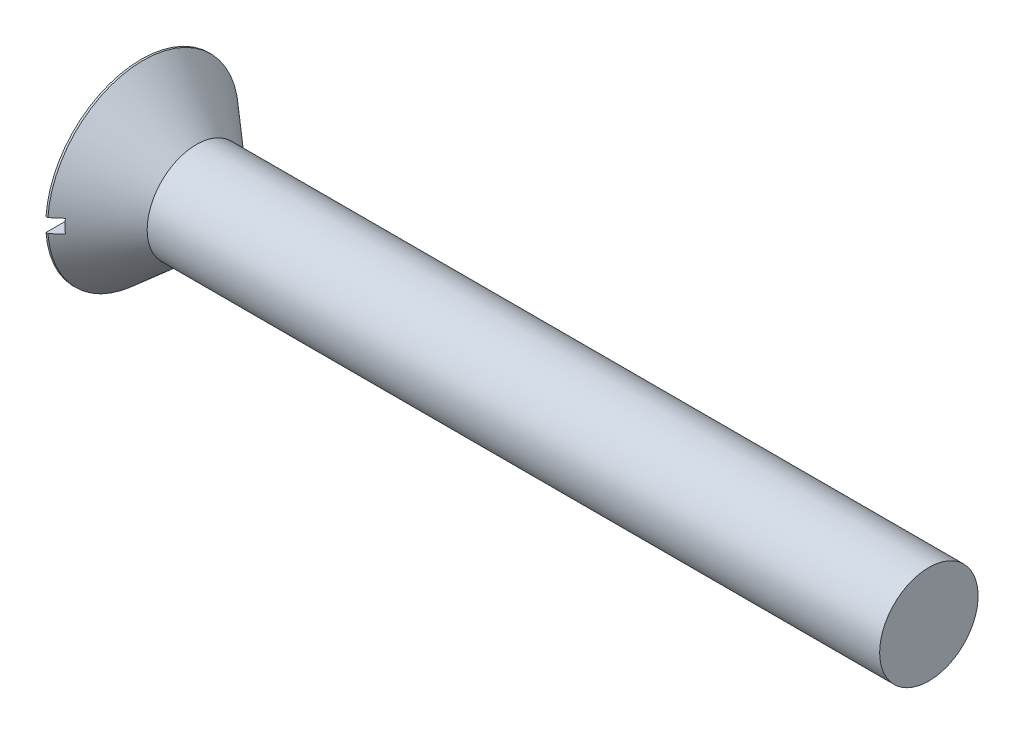
ISO-10303-21;
HEADER;
FILE_DESCRIPTION(('STEP AP214'),'2;1');
FILE_NAME('part.step','',(''),(''),'','','');
FILE_SCHEMA(('AUTOMOTIVE_DESIGN { 1 0 10303 214 1 1 1 1 }'));
ENDSEC;
DATA;
#1=APPLICATION_CONTEXT('core data for automotive mechanical design processes');
#2=APPLICATION_PROTOCOL_DEFINITION('international standard','automotive_design',2000,#1);
#3=PRODUCT_CONTEXT('',#1,'mechanical');
#4=PRODUCT('Part','Part','',(#3));
#5=PRODUCT_RELATED_PRODUCT_CATEGORY('part','',(#4));
#6=PRODUCT_DEFINITION_FORMATION('','',#4);
#7=PRODUCT_DEFINITION_CONTEXT('part definition',#1,'design');
#8=PRODUCT_DEFINITION('design','',#6,#7);
#9=PRODUCT_DEFINITION_SHAPE('','',#8);
#10=(LENGTH_UNIT() NAMED_UNIT(*) SI_UNIT(.MILLI.,.METRE.));
#11=(NAMED_UNIT(*) PLANE_ANGLE_UNIT() SI_UNIT($,.RADIAN.));
#12=(NAMED_UNIT(*) SI_UNIT($,.STERADIAN.) SOLID_ANGLE_UNIT());
#13=UNCERTAINTY_MEASURE_WITH_UNIT(LENGTH_MEASURE(1.E-05),#10,'distance_accuracy_value','');
#14=(GEOMETRIC_REPRESENTATION_CONTEXT(3) GLOBAL_UNCERTAINTY_ASSIGNED_CONTEXT((#13)) GLOBAL_UNIT_ASSIGNED_CONTEXT((#10,
#11,#12)) REPRESENTATION_CONTEXT('',''));
#15=CARTESIAN_POINT('',(0.,0.,0.));
#16=DIRECTION('',(0.,0.,1.));
#17=DIRECTION('',(1.,0.,0.));
#18=AXIS2_PLACEMENT_3D('',#15,#16,#17);
#19=CARTESIAN_POINT('',(0.,0.,0.));
#20=DIRECTION('',(-1.,0.,0.));
#21=DIRECTION('',(0.,0.,1.));
#22=AXIS2_PLACEMENT_3D('',#19,#20,#21);
#23=PLANE('',#22);
#24=DIRECTION('',(0.,0.,-1.));
#25=VECTOR('',#24,1.);
#26=CARTESIAN_POINT('',(0.,0.889000000000002,12.319));
#27=LINE('',#26,#25);
#28=CARTESIAN_POINT('',(0.,0.889000000000001,12.286880808407));
#29=VERTEX_POINT('',#28);
#30=CARTESIAN_POINT('',(0.,0.888999999999998,-12.286880808407));
#31=VERTEX_POINT('',#30);
#32=EDGE_CURVE('E167',#29,#31,#27,.T.);
#33=ORIENTED_EDGE('',*,*,#32,.F.);
#34=CARTESIAN_POINT('',(0.,0.,0.));
#35=DIRECTION('',(-1.,0.,0.));
#36=DIRECTION('',(0.,0.,1.));
#37=AXIS2_PLACEMENT_3D('',#34,#35,#36);
#38=CIRCLE('',#37,12.319);
#39=EDGE_CURVE('E110',#29,#31,#38,.T.);
#40=ORIENTED_EDGE('',*,*,#39,.T.);
#41=EDGE_LOOP('',(#33,#40));
#42=FACE_BOUND('',#41,.T.);
#43=ADVANCED_FACE('F41',(#42),#23,.T.);
#44=CARTESIAN_POINT('',(-6.34999999999999,0.,0.));
#45=DIRECTION('',(-1.,0.,0.));
#46=DIRECTION('',(0.,0.,1.));
#47=AXIS2_PLACEMENT_3D('',#44,#45,#46);
#48=CYLINDRICAL_SURFACE('',#47,12.319);
#49=DIRECTION('',(-1.,0.,0.));
#50=VECTOR('',#49,1.);
#51=CARTESIAN_POINT('',(-6.34999999999999,0.888999999999999,-12.286880808407));
#52=LINE('',#51,#50);
#53=CARTESIAN_POINT('',(0.245450977297823,0.888999999999999,-12.286880808407));
#54=VERTEX_POINT('',#53);
#55=EDGE_CURVE('E71',#31,#54,#52,.F.);
#56=ORIENTED_EDGE('',*,*,#55,.F.);
#57=ORIENTED_EDGE('',*,*,#39,.F.);
#58=DIRECTION('',(-1.,0.,0.));
#59=VECTOR('',#58,1.);
#60=CARTESIAN_POINT('',(-6.34999999999999,0.889000000000002,12.286880808407));
#61=LINE('',#60,#59);
#62=CARTESIAN_POINT('',(0.245450977297822,0.889000000000002,12.286880808407));
#63=VERTEX_POINT('',#62);
#64=EDGE_CURVE('E170',#63,#29,#61,.T.);
#65=ORIENTED_EDGE('',*,*,#64,.F.);
#66=CARTESIAN_POINT('',(0.245450977297823,0.,0.));
#67=DIRECTION('',(-1.,0.,0.));
#68=DIRECTION('',(0.,0.,1.));
#69=AXIS2_PLACEMENT_3D('',#66,#67,#68);
#70=CIRCLE('',#69,12.319);
#71=EDGE_CURVE('E122',#63,#54,#70,.T.);
#72=ORIENTED_EDGE('',*,*,#71,.T.);
#73=EDGE_LOOP('',(#56,#57,#65,#72));
#74=FACE_BOUND('',#73,.T.);
#75=ADVANCED_FACE('F169',(#74),#48,.T.);
#76=DIRECTION('',(0.,0.,1.));
#77=VECTOR('',#76,1.);
#78=CARTESIAN_POINT('',(0.,-0.889000000000001,-12.319));
#79=LINE('',#78,#77);
#80=CARTESIAN_POINT('',(0.,-0.889000000000001,-12.286880808407));
#81=VERTEX_POINT('',#80);
#82=CARTESIAN_POINT('',(0.,-0.889000000000001,12.286880808407));
#83=VERTEX_POINT('',#82);
#84=EDGE_CURVE('E116',#81,#83,#79,.T.);
#85=ORIENTED_EDGE('',*,*,#84,.F.);
#86=EDGE_CURVE('E146',#81,#83,#38,.T.);
#87=ORIENTED_EDGE('',*,*,#86,.T.);
#88=EDGE_LOOP('',(#85,#87));
#89=FACE_BOUND('',#88,.T.);
#90=ADVANCED_FACE('F43',(#89),#23,.T.);
#91=DIRECTION('',(-1.,0.,0.));
#92=VECTOR('',#91,1.);
#93=CARTESIAN_POINT('',(-6.34999999999999,-0.889000000000001,12.286880808407));
#94=LINE('',#93,#92);
#95=CARTESIAN_POINT('',(0.245450977297823,-0.889000000000001,12.286880808407));
#96=VERTEX_POINT('',#95);
#97=EDGE_CURVE('E148',#83,#96,#94,.F.);
#98=ORIENTED_EDGE('',*,*,#97,.F.);
#99=ORIENTED_EDGE('',*,*,#86,.F.);
#100=DIRECTION('',(-1.,0.,0.));
#101=VECTOR('',#100,1.);
#102=CARTESIAN_POINT('',(-6.34999999999999,-0.889000000000001,-12.286880808407));
#103=LINE('',#102,#101);
#104=CARTESIAN_POINT('',(0.245450977297823,-0.889000000000001,-12.286880808407));
#105=VERTEX_POINT('',#104);
#106=EDGE_CURVE('E136',#105,#81,#103,.T.);
#107=ORIENTED_EDGE('',*,*,#106,.F.);
#108=EDGE_CURVE('E144',#105,#96,#70,.T.);
#109=ORIENTED_EDGE('',*,*,#108,.T.);
#110=EDGE_LOOP('',(#98,#99,#107,#109));
#111=FACE_BOUND('',#110,.T.);
#112=ADVANCED_FACE('F143',(#111),#48,.T.);
#113=CARTESIAN_POINT('',(0.245450977297823,0.,0.));
#114=DIRECTION('',(-1.,0.,0.));
#115=DIRECTION('',(0.,0.,1.));
#116=AXIS2_PLACEMENT_3D('',#113,#114,#115);
#117=CONICAL_SURFACE('',#116,12.319,0.715584993317677);
#118=CARTESIAN_POINT('',(-14.5551411587931,0.888999999999997,-25.169263227534));
#119=CARTESIAN_POINT('',(-13.6116315748377,0.888999999999997,-24.3485679447048));
#120=CARTESIAN_POINT('',(-12.6681435319224,0.888999999999997,-23.5278478918582));
#121=CARTESIAN_POINT('',(-10.7812351121085,0.888999999999997,-21.8863288242787));
#122=CARTESIAN_POINT('',(-9.83781473525217,0.888999999999997,-21.0655298094972));
#123=CARTESIAN_POINT('',(-7.95103007076821,0.888999999999998,-19.4237919313902));
#124=CARTESIAN_POINT('',(-7.00766578683745,0.888999999999998,-18.6028530638159));
#125=CARTESIAN_POINT('',(-5.12107540454132,0.888999999999998,-16.9608176849098));
#126=CARTESIAN_POINT('',(-4.17784930609396,0.888999999999998,-16.1397211736721));
#127=CARTESIAN_POINT('',(-2.26628909618739,0.888999999999998,-14.4752311823123));
#128=CARTESIAN_POINT('',(-1.29796083579062,0.888999999999998,-13.6318309826034));
#129=CARTESIAN_POINT('',(0.638319260654705,0.888999999999999,-11.9445949963252));
#130=CARTESIAN_POINT('',(1.60627109603541,0.888999999999999,-11.1007592089892));
#131=CARTESIAN_POINT('',(3.05762484421906,0.888999999999999,-9.83437996543735));
#132=CARTESIAN_POINT('',(3.54130575594833,0.888999999999999,-9.41215628639985));
#133=CARTESIAN_POINT('',(4.50838694687554,0.888999999999999,-8.56738769648048));
#134=CARTESIAN_POINT('',(4.9917872261095,0.888999999999999,-8.14484278563986));
#135=CARTESIAN_POINT('',(5.95814599419228,0.888999999999999,-7.29925088262449));
#136=CARTESIAN_POINT('',(6.44110448432653,0.888999999999999,-6.87620389191886));
#137=CARTESIAN_POINT('',(7.4062875505902,0.888999999999999,-6.02927377170035));
#138=CARTESIAN_POINT('',(7.88851212763372,0.888999999999999,-5.6053906432304));
#139=CARTESIAN_POINT('',(8.6195277039508,0.888999999999999,-4.96063042196199));
#140=CARTESIAN_POINT('',(8.86884178125162,0.888999999999999,-4.74034671780844));
#141=CARTESIAN_POINT('',(9.36689414916273,0.888999999999999,-4.29910334302774));
#142=CARTESIAN_POINT('',(9.61563240947002,0.889,-4.07814363818477));
#143=CARTESIAN_POINT('',(10.1107929185816,0.889,-3.63643149913079));
#144=CARTESIAN_POINT('',(10.3572203299295,0.888999999999999,-3.41568486558542));
#145=CARTESIAN_POINT('',(10.7256374787167,0.889,-3.08324196593378));
#146=CARTESIAN_POINT('',(10.8482306903894,0.889,-2.97221496629208));
#147=CARTESIAN_POINT('',(11.0928524713659,0.889,-2.74954082117221));
#148=CARTESIAN_POINT('',(11.2148810421947,0.889,-2.63789367737072));
#149=CARTESIAN_POINT('',(11.4577513940792,0.889,-2.41407707228762));
#150=CARTESIAN_POINT('',(11.5785957009388,0.889,-2.30191035898632));
#151=CARTESIAN_POINT('',(11.8191202959369,0.889,-2.07624210041266));
#152=CARTESIAN_POINT('',(11.9388001166896,0.889,-1.96274005653881));
#153=CARTESIAN_POINT('',(12.1775970240016,0.889,-1.732420959755));
#154=CARTESIAN_POINT('',(12.2966921052508,0.889,-1.61558085840986));
#155=CARTESIAN_POINT('',(12.4725944631053,0.889,-1.43771774183129));
#156=CARTESIAN_POINT('',(12.530744355155,0.889,-1.37802576488454));
#157=CARTESIAN_POINT('',(12.6457640471361,0.889,-1.2574213794329));
#158=CARTESIAN_POINT('',(12.7026339361501,0.889,-1.19650905641988));
#159=CARTESIAN_POINT('',(12.8154060379138,0.889,-1.07197692667333));
#160=CARTESIAN_POINT('',(12.8712775685345,0.889,-1.00832922348416));
#161=CARTESIAN_POINT('',(12.9799876814358,0.889,-0.878506288214569));
#162=CARTESIAN_POINT('',(13.032828179744,0.889,-0.812332697907101));
#163=CARTESIAN_POINT('',(13.1078788460938,0.889,-0.710676010668516));
#164=CARTESIAN_POINT('',(13.13203848091,0.889,-0.676638743704657));
#165=CARTESIAN_POINT('',(13.1786577281485,0.889,-0.607425717644619));
#166=CARTESIAN_POINT('',(13.2011179695318,0.889,-0.572250386705729));
#167=CARTESIAN_POINT('',(13.2436554341221,0.889,-0.500673329171807));
#168=CARTESIAN_POINT('',(13.2637423021657,0.889,-0.464277396384556));
#169=CARTESIAN_POINT('',(13.3007734629834,0.889,-0.389937187799729));
#170=CARTESIAN_POINT('',(13.3177216857014,0.889,-0.351994921857602));
#171=CARTESIAN_POINT('',(13.3411696944475,0.889,-0.290651209419416));
#172=CARTESIAN_POINT('',(13.3490780668283,0.889,-0.267790020632477));
#173=CARTESIAN_POINT('',(13.3631973102161,0.889,-0.221545972764199));
#174=CARTESIAN_POINT('',(13.369407815258,0.889,-0.198163002388898));
#175=CARTESIAN_POINT('',(13.3850581871105,0.889,-0.12747349223747));
#176=CARTESIAN_POINT('',(13.3915839897852,0.889,-0.0794600811514929));
#177=CARTESIAN_POINT('',(13.3954868030744,0.889,0.0172160745595656));
#178=CARTESIAN_POINT('',(13.3928116438412,0.889,0.0658809583055846));
#179=CARTESIAN_POINT('',(13.3787804514962,0.889,0.162005506692571));
#180=CARTESIAN_POINT('',(13.3674015193288,0.889,0.209461650347702));
#181=CARTESIAN_POINT('',(13.3414969791091,0.889,0.290933949588058));
#182=CARTESIAN_POINT('',(13.3283944919338,0.889,0.325428602704014));
#183=CARTESIAN_POINT('',(13.2992046437468,0.889,0.393146219474562));
#184=CARTESIAN_POINT('',(13.2831151204499,0.889,0.426368240733003));
#185=CARTESIAN_POINT('',(13.2486172849937,0.889,0.491740097795348));
#186=CARTESIAN_POINT('',(13.230199775807,0.889,0.523885003475501));
#187=CARTESIAN_POINT('',(13.1916567698303,0.889,0.587106051368686));
#188=CARTESIAN_POINT('',(13.171531947445,0.889,0.618182608835584));
#189=CARTESIAN_POINT('',(13.1057880773392,0.889,0.715153831917716));
#190=CARTESIAN_POINT('',(13.0577869558326,0.889,0.779425303656192));
#191=CARTESIAN_POINT('',(12.958256032993,0.889,0.905196360009961));
#192=CARTESIAN_POINT('',(12.9067228155881,0.889,0.966693163018744));
#193=CARTESIAN_POINT('',(12.8012947203853,0.889,1.08789338970996));
#194=CARTESIAN_POINT('',(12.7473941718126,0.889,1.14759185681334));
#195=CARTESIAN_POINT('',(12.6380954597358,0.889,1.2656037345774));
#196=CARTESIAN_POINT('',(12.5826971215165,0.889,1.32391698215046));
#197=CARTESIAN_POINT('',(12.4706030945583,0.889,1.4397839702915));
#198=CARTESIAN_POINT('',(12.4139027244772,0.889,1.49733316810013));
#199=CARTESIAN_POINT('',(12.2997275827102,0.889,1.61166719286354));
#200=CARTESIAN_POINT('',(12.2422527359588,0.889,1.66845194464308));
#201=CARTESIAN_POINT('',(12.126829960486,0.889,1.78132875819207));
#202=CARTESIAN_POINT('',(12.0688830693135,0.889,1.83742188266493));
#203=CARTESIAN_POINT('',(11.9525475001467,0.889,1.94914320946));
#204=CARTESIAN_POINT('',(11.8941588382865,0.889,2.00477142860644));
#205=CARTESIAN_POINT('',(11.719906643352,0.889,2.16975242349473));
#206=CARTESIAN_POINT('',(11.6035415676728,0.889,2.27857522118505));
#207=CARTESIAN_POINT('',(11.3699290774586,0.889,2.49527039004713));
#208=CARTESIAN_POINT('',(11.2526816480623,0.889,2.60314274514417));
#209=CARTESIAN_POINT('',(10.9000248352405,0.889,2.92578677986416));
#210=CARTESIAN_POINT('',(10.663714454193,0.889,3.13957277256669));
#211=CARTESIAN_POINT('',(10.1896363317581,0.889,3.5659001037286));
#212=CARTESIAN_POINT('',(9.95186757464194,0.889000000000001,3.77844030805435));
#213=CARTESIAN_POINT('',(9.47555907706543,0.889000000000001,4.20263938704366));
#214=CARTESIAN_POINT('',(9.23701936173964,0.889000000000001,4.41429828993444));
#215=CARTESIAN_POINT('',(8.76086290526725,0.889000000000001,4.83578711417112));
#216=CARTESIAN_POINT('',(8.52324915053302,0.889000000000001,5.04562041270876));
#217=CARTESIAN_POINT('',(8.04767792056621,0.889000000000001,5.46490112860689));
#218=CARTESIAN_POINT('',(7.80972044243171,0.889000000000001,5.6743485426751));
#219=CARTESIAN_POINT('',(7.33363183817465,0.889000000000001,6.09290325813102));
#220=CARTESIAN_POINT('',(7.09550078456149,0.889000000000001,6.30201064202003));
#221=CARTESIAN_POINT('',(6.61905803388425,0.889000000000001,6.72001816643191));
#222=CARTESIAN_POINT('',(6.38074633731646,0.889000000000001,6.92891830752054));
#223=CARTESIAN_POINT('',(5.71519119590461,0.889000000000001,7.51194857972561));
#224=CARTESIAN_POINT('',(5.28779686729787,0.889000000000001,7.88590645577575));
#225=CARTESIAN_POINT('',(4.43272530190372,0.889000000000001,8.63349866001973));
#226=CARTESIAN_POINT('',(4.00504806507182,0.889000000000001,9.00713298816267));
#227=CARTESIAN_POINT('',(2.72172936631492,0.889000000000001,10.1277096869876));
#228=CARTESIAN_POINT('',(1.86580210981983,0.889000000000001,10.8743247276024));
#229=CARTESIAN_POINT('',(0.153438616250454,0.889000000000002,12.3672004692948));
#230=CARTESIAN_POINT('',(-0.702997673340844,0.889000000000002,13.1134611101107));
#231=CARTESIAN_POINT('',(-2.4161093760712,0.889000000000002,14.605706945377));
#232=CARTESIAN_POINT('',(-3.27278478908173,0.889000000000002,15.3516921399749));
#233=CARTESIAN_POINT('',(-4.99819124427169,0.889000000000002,16.8538497195678));
#234=CARTESIAN_POINT('',(-5.86692442415562,0.889000000000002,17.6100196489247));
#235=CARTESIAN_POINT('',(-7.6044975703065,0.889000000000002,19.1222371224039));
#236=CARTESIAN_POINT('',(-8.47333753659272,0.889000000000002,19.878284666504));
#237=CARTESIAN_POINT('',(-10.2109735845069,0.889000000000003,21.3901900741188));
#238=CARTESIAN_POINT('',(-11.0797696558693,0.889000000000003,22.1460479494322));
#239=CARTESIAN_POINT('',(-12.8174179360932,0.889000000000003,23.6576988330354));
#240=CARTESIAN_POINT('',(-13.686270144944,0.889000000000003,24.4134918413377));
#241=CARTESIAN_POINT('',(-14.5551411587931,0.889000000000003,25.169263227534));
#242=B_SPLINE_CURVE_WITH_KNOTS('',3,(#118,#119,#120,#121,#122,#123,#124,#125,#126,#127,#128,
#129,#130,#131,#132,#133,#134,#135,#136,#137,#138,#139,#140,#141,#142,#143,#144,#145,#146,#147,
#148,#149,#150,#151,#152,#153,#154,#155,#156,#157,#158,#159,#160,#161,#162,#163,#164,#165,#166,
#167,#168,#169,#170,#171,#172,#173,#174,#175,#176,#177,#178,#179,#180,#181,#182,#183,#184,#185,
#186,#187,#188,#189,#190,#191,#192,#193,#194,#195,#196,#197,#198,#199,#200,#201,#202,#203,#204,
#205,#206,#207,#208,#209,#210,#211,#212,#213,#214,#215,#216,#217,#218,#219,#220,#221,#222,#223,
#224,#225,#226,#227,#228,#229,#230,#231,#232,#233,#234,#235,#236,#237,#238,#239,#240,#241),
.UNSPECIFIED.,.F.,.F.,(4,2,2,2,2,2,2,2,2,2,2,2,2,2,2,2,2,2,2,2,2,2,2,2,2,2,2,2,2,2,2,2,2,2,2,2,
2,2,2,2,2,2,2,2,2,2,2,2,2,2,2,2,2,2,2,2,2,2,2,2,2,4),(0.,3.75150100351246,7.50300433312614,
11.2546561158045,15.0063056636505,18.8586882201447,22.7110775806291,24.6372084803146,
26.5633391327328,28.4894641630001,30.4155867923026,31.4136549737794,32.4117745371118,
33.4042905269038,33.9004792946155,34.3966667214339,34.8912932388447,35.3861107093333,
35.8865745916499,36.1365643615282,36.3865366790863,36.6405657347049,36.8944323982509,
37.0196161761828,37.1447533934938,37.2693631888845,37.3938158877175,37.4663279182904,
37.5388555660953,37.6833789308947,37.8287230970594,37.9744509750656,38.0849930958725,
38.1956155512378,38.3066895586843,38.417719893335,38.6581254013915,38.8987667914573,
39.1400199411819,39.3813013552583,39.6236580196643,39.8660383457136,40.1079824646195,
40.3499177896851,40.8278718645498,41.3058340075356,42.261813863698,43.2185594598862,
44.1752741730256,45.1262798852668,46.0772936740089,47.0280251748799,47.9787540731288,
49.6824537685839,51.3861537320468,54.7935584173539,58.2014158406751,61.6092714357216,
65.0644722415091,68.5196736718461,71.9744022644319,75.4291301928686),.UNSPECIFIED.);
#243=CARTESIAN_POINT('',(1.4478,0.888999999999998,-11.2387081001944));
#244=VERTEX_POINT('',#243);
#245=EDGE_CURVE('E11',#54,#244,#242,.T.);
#246=ORIENTED_EDGE('',*,*,#245,.F.);
#247=ORIENTED_EDGE('',*,*,#71,.F.);
#248=CARTESIAN_POINT('',(1.4478,0.889000000000001,11.2387081001944));
#249=VERTEX_POINT('',#248);
#250=EDGE_CURVE('E45',#249,#63,#242,.T.);
#251=ORIENTED_EDGE('',*,*,#250,.F.);
#252=CARTESIAN_POINT('',(1.4478,0.,0.));
#253=DIRECTION('',(-1.,0.,0.));
#254=DIRECTION('',(0.,0.,1.));
#255=AXIS2_PLACEMENT_3D('',#252,#253,#254);
#256=CIRCLE('',#255,11.2738139403387);
#257=CARTESIAN_POINT('',(1.4478,-0.889000000000001,11.2387081001944));
#258=VERTEX_POINT('',#257);
#259=EDGE_CURVE('E100',#249,#258,#256,.F.);
#260=ORIENTED_EDGE('',*,*,#259,.T.);
#261=CARTESIAN_POINT('',(-14.5551411587931,-0.889000000000001,25.169263227534));
#262=CARTESIAN_POINT('',(-13.6116315748377,-0.889000000000001,24.3485679447048));
#263=CARTESIAN_POINT('',(-12.6681435319224,-0.889000000000001,23.5278478918582));
#264=CARTESIAN_POINT('',(-10.7812351121085,-0.889000000000001,21.8863288242787));
#265=CARTESIAN_POINT('',(-9.83781473525217,-0.889000000000001,21.0655298094973));
#266=CARTESIAN_POINT('',(-7.95103007076822,-0.889000000000001,19.4237919313902));
#267=CARTESIAN_POINT('',(-7.00766578683746,-0.889000000000001,18.6028530638159));
#268=CARTESIAN_POINT('',(-5.12107540454133,-0.889000000000001,16.9608176849098));
#269=CARTESIAN_POINT('',(-4.17784930609397,-0.889000000000001,16.1397211736721));
#270=CARTESIAN_POINT('',(-2.26628909618739,-0.889000000000001,14.4752311823124));
#271=CARTESIAN_POINT('',(-1.29796083579062,-0.889000000000001,13.6318309826034));
#272=CARTESIAN_POINT('',(0.638319260654701,-0.889000000000001,11.9445949963252));
#273=CARTESIAN_POINT('',(1.6062710960354,-0.889000000000001,11.1007592089892));
#274=CARTESIAN_POINT('',(3.05762484421906,-0.889000000000001,9.83437996543735));
#275=CARTESIAN_POINT('',(3.54130575594833,-0.889000000000001,9.41215628639985));
#276=CARTESIAN_POINT('',(4.50838694687554,-0.889000000000001,8.56738769648049));
#277=CARTESIAN_POINT('',(4.9917872261095,-0.889000000000001,8.14484278563986));
#278=CARTESIAN_POINT('',(5.95814599419228,-0.889000000000001,7.29925088262449));
#279=CARTESIAN_POINT('',(6.44110448432652,-0.889000000000001,6.87620389191886));
#280=CARTESIAN_POINT('',(7.4062875505902,-0.889000000000001,6.02927377170035));
#281=CARTESIAN_POINT('',(7.88851212763371,-0.889000000000001,5.6053906432304));
#282=CARTESIAN_POINT('',(8.6195277039508,-0.889000000000001,4.96063042196199));
#283=CARTESIAN_POINT('',(8.86884178125162,-0.889000000000001,4.74034671780844));
#284=CARTESIAN_POINT('',(9.36689414916274,-0.889000000000001,4.29910334302774));
#285=CARTESIAN_POINT('',(9.61563240947002,-0.889000000000001,4.07814363818477));
#286=CARTESIAN_POINT('',(10.1107929185816,-0.889000000000001,3.63643149913079));
#287=CARTESIAN_POINT('',(10.3572203299295,-0.889000000000001,3.41568486558542));
#288=CARTESIAN_POINT('',(10.7256374787167,-0.889000000000001,3.08324196593378));
#289=CARTESIAN_POINT('',(10.8482306903894,-0.889000000000001,2.97221496629208));
#290=CARTESIAN_POINT('',(11.0928524713659,-0.889000000000001,2.74954082117221));
#291=CARTESIAN_POINT('',(11.2148810421947,-0.889000000000001,2.63789367737072));
#292=CARTESIAN_POINT('',(11.4577513940792,-0.889000000000001,2.41407707228762));
#293=CARTESIAN_POINT('',(11.5785957009388,-0.889000000000001,2.30191035898631));
#294=CARTESIAN_POINT('',(11.8191202959369,-0.889000000000001,2.07624210041266));
#295=CARTESIAN_POINT('',(11.9388001166896,-0.889000000000001,1.9627400565388));
#296=CARTESIAN_POINT('',(12.1775970240016,-0.889000000000001,1.732420959755));
#297=CARTESIAN_POINT('',(12.2966921052508,-0.889000000000001,1.61558085840986));
#298=CARTESIAN_POINT('',(12.4725944631053,-0.889000000000001,1.43771774183129));
#299=CARTESIAN_POINT('',(12.530744355155,-0.889000000000001,1.37802576488454));
#300=CARTESIAN_POINT('',(12.6457640471361,-0.889000000000001,1.2574213794329));
#301=CARTESIAN_POINT('',(12.7026339361501,-0.889000000000001,1.19650905641988));
#302=CARTESIAN_POINT('',(12.8154060379138,-0.889000000000001,1.07197692667333));
#303=CARTESIAN_POINT('',(12.8712775685345,-0.889000000000001,1.00832922348416));
#304=CARTESIAN_POINT('',(12.9799876814358,-0.889000000000001,0.878506288214569));
#305=CARTESIAN_POINT('',(13.032828179744,-0.889000000000001,0.812332697907102));
#306=CARTESIAN_POINT('',(13.1078788460938,-0.889000000000001,0.710676010668515));
#307=CARTESIAN_POINT('',(13.13203848091,-0.889000000000001,0.676638743704655));
#308=CARTESIAN_POINT('',(13.1786577281485,-0.889000000000001,0.607425717644618));
#309=CARTESIAN_POINT('',(13.2011179695318,-0.889000000000001,0.572250386705728));
#310=CARTESIAN_POINT('',(13.2436554341221,-0.889000000000001,0.500673329171807));
#311=CARTESIAN_POINT('',(13.2637423021657,-0.889000000000001,0.464277396384556));
#312=CARTESIAN_POINT('',(13.3007734629834,-0.889000000000001,0.389937187799729));
#313=CARTESIAN_POINT('',(13.3177216857014,-0.889000000000001,0.351994921857602));
#314=CARTESIAN_POINT('',(13.3411696944475,-0.889000000000001,0.290651209419415));
#315=CARTESIAN_POINT('',(13.3490780668283,-0.889000000000001,0.267790020632475));
#316=CARTESIAN_POINT('',(13.3631973102161,-0.889000000000001,0.221545972764197));
#317=CARTESIAN_POINT('',(13.369407815258,-0.889000000000001,0.198163002388896));
#318=CARTESIAN_POINT('',(13.3850581871105,-0.889000000000001,0.127473492237469));
#319=CARTESIAN_POINT('',(13.3915839897852,-0.889000000000001,0.0794600811514914));
#320=CARTESIAN_POINT('',(13.3954868030744,-0.889000000000001,-0.0172160745595677));
#321=CARTESIAN_POINT('',(13.3928116438412,-0.889000000000001,-0.0658809583055867));
#322=CARTESIAN_POINT('',(13.3787804514962,-0.889000000000001,-0.162005506692572));
#323=CARTESIAN_POINT('',(13.3674015193288,-0.889000000000001,-0.209461650347704));
#324=CARTESIAN_POINT('',(13.3414969791091,-0.889000000000001,-0.290933949588061));
#325=CARTESIAN_POINT('',(13.3283944919338,-0.889000000000001,-0.325428602704017));
#326=CARTESIAN_POINT('',(13.2992046437468,-0.889000000000001,-0.393146219474565));
#327=CARTESIAN_POINT('',(13.2831151204499,-0.889000000000001,-0.426368240733005));
#328=CARTESIAN_POINT('',(13.2486172849937,-0.889000000000001,-0.491740097795351));
#329=CARTESIAN_POINT('',(13.230199775807,-0.889000000000001,-0.523885003475504));
#330=CARTESIAN_POINT('',(13.1916567698303,-0.889000000000001,-0.58710605136869));
#331=CARTESIAN_POINT('',(13.171531947445,-0.889000000000001,-0.618182608835587));
#332=CARTESIAN_POINT('',(13.1057880773392,-0.889000000000001,-0.715153831917718));
#333=CARTESIAN_POINT('',(13.0577869558326,-0.889000000000001,-0.779425303656196));
#334=CARTESIAN_POINT('',(12.958256032993,-0.889000000000001,-0.905196360009967));
#335=CARTESIAN_POINT('',(12.9067228155881,-0.889000000000001,-0.96669316301875));
#336=CARTESIAN_POINT('',(12.8012947203853,-0.889000000000001,-1.08789338970997));
#337=CARTESIAN_POINT('',(12.7473941718126,-0.889000000000001,-1.14759185681335));
#338=CARTESIAN_POINT('',(12.6380954597358,-0.889000000000001,-1.26560373457741));
#339=CARTESIAN_POINT('',(12.5826971215165,-0.889000000000001,-1.32391698215046));
#340=CARTESIAN_POINT('',(12.4706030945583,-0.889000000000001,-1.4397839702915));
#341=CARTESIAN_POINT('',(12.4139027244772,-0.889000000000001,-1.49733316810014));
#342=CARTESIAN_POINT('',(12.2997275827102,-0.889000000000001,-1.61166719286355));
#343=CARTESIAN_POINT('',(12.2422527359588,-0.889000000000001,-1.66845194464309));
#344=CARTESIAN_POINT('',(12.126829960486,-0.889000000000001,-1.78132875819209));
#345=CARTESIAN_POINT('',(12.0688830693135,-0.889000000000001,-1.83742188266495));
#346=CARTESIAN_POINT('',(11.9525475001467,-0.889000000000001,-1.94914320946001));
#347=CARTESIAN_POINT('',(11.8941588382865,-0.889000000000001,-2.00477142860645));
#348=CARTESIAN_POINT('',(11.7199066433519,-0.889000000000001,-2.16975242349474));
#349=CARTESIAN_POINT('',(11.6035415676728,-0.889000000000001,-2.27857522118506));
#350=CARTESIAN_POINT('',(11.3699290774586,-0.889000000000001,-2.49527039004714));
#351=CARTESIAN_POINT('',(11.2526816480623,-0.889000000000001,-2.60314274514418));
#352=CARTESIAN_POINT('',(10.9000248352405,-0.889000000000001,-2.92578677986417));
#353=CARTESIAN_POINT('',(10.663714454193,-0.889000000000001,-3.13957277256671));
#354=CARTESIAN_POINT('',(10.1896363317581,-0.889000000000001,-3.56590010372862));
#355=CARTESIAN_POINT('',(9.95186757464192,-0.889000000000001,-3.77844030805437));
#356=CARTESIAN_POINT('',(9.47555907706541,-0.889000000000001,-4.20263938704368));
#357=CARTESIAN_POINT('',(9.23701936173962,-0.889000000000001,-4.41429828993446));
#358=CARTESIAN_POINT('',(8.76086290526722,-0.889000000000001,-4.83578711417114));
#359=CARTESIAN_POINT('',(8.52324915053298,-0.889000000000001,-5.04562041270879));
#360=CARTESIAN_POINT('',(8.04767792056618,-0.889000000000001,-5.46490112860692));
#361=CARTESIAN_POINT('',(7.80972044243167,-0.889000000000001,-5.67434854267513));
#362=CARTESIAN_POINT('',(7.33363183817461,-0.889000000000001,-6.09290325813106));
#363=CARTESIAN_POINT('',(7.09550078456145,-0.889000000000001,-6.30201064202006));
#364=CARTESIAN_POINT('',(6.6190580338842,-0.889000000000001,-6.72001816643195));
#365=CARTESIAN_POINT('',(6.38074633731641,-0.889000000000001,-6.92891830752058));
#366=CARTESIAN_POINT('',(5.71519119590456,-0.889000000000001,-7.51194857972566));
#367=CARTESIAN_POINT('',(5.28779686729782,-0.889000000000001,-7.88590645577579));
#368=CARTESIAN_POINT('',(4.43272530190368,-0.889000000000001,-8.63349866001977));
#369=CARTESIAN_POINT('',(4.00504806507177,-0.889000000000001,-9.00713298816271));
#370=CARTESIAN_POINT('',(2.72172936631488,-0.889000000000001,-10.1277096869877));
#371=CARTESIAN_POINT('',(1.86580210981978,-0.889000000000001,-10.8743247276025));
#372=CARTESIAN_POINT('',(0.153438616250411,-0.889000000000001,-12.3672004692948));
#373=CARTESIAN_POINT('',(-0.702997673340886,-0.889000000000001,-13.1134611101108));
#374=CARTESIAN_POINT('',(-2.41610937607125,-0.889000000000001,-14.6057069453771));
#375=CARTESIAN_POINT('',(-3.27278478908178,-0.889000000000001,-15.351692139975));
#376=CARTESIAN_POINT('',(-4.99819124427173,-0.889000000000001,-16.8538497195679));
#377=CARTESIAN_POINT('',(-5.86692442415566,-0.889000000000001,-17.6100196489248));
#378=CARTESIAN_POINT('',(-7.60449757030652,-0.889000000000001,-19.1222371224039));
#379=CARTESIAN_POINT('',(-8.47333753659274,-0.889000000000001,-19.878284666504));
#380=CARTESIAN_POINT('',(-10.2109735845069,-0.889000000000001,-21.3901900741189));
#381=CARTESIAN_POINT('',(-11.0797696558693,-0.889000000000001,-22.1460479494323));
#382=CARTESIAN_POINT('',(-12.8174179360932,-0.889000000000001,-23.6576988330355));
#383=CARTESIAN_POINT('',(-13.686270144944,-0.889000000000001,-24.4134918413377));
#384=CARTESIAN_POINT('',(-14.5551411587931,-0.889000000000001,-25.169263227534));
#385=B_SPLINE_CURVE_WITH_KNOTS('',3,(#261,#262,#263,#264,#265,#266,#267,#268,#269,#270,#271,
#272,#273,#274,#275,#276,#277,#278,#279,#280,#281,#282,#283,#284,#285,#286,#287,#288,#289,#290,
#291,#292,#293,#294,#295,#296,#297,#298,#299,#300,#301,#302,#303,#304,#305,#306,#307,#308,#309,
#310,#311,#312,#313,#314,#315,#316,#317,#318,#319,#320,#321,#322,#323,#324,#325,#326,#327,#328,
#329,#330,#331,#332,#333,#334,#335,#336,#337,#338,#339,#340,#341,#342,#343,#344,#345,#346,#347,
#348,#349,#350,#351,#352,#353,#354,#355,#356,#357,#358,#359,#360,#361,#362,#363,#364,#365,#366,
#367,#368,#369,#370,#371,#372,#373,#374,#375,#376,#377,#378,#379,#380,#381,#382,#383,#384),
.UNSPECIFIED.,.F.,.F.,(4,2,2,2,2,2,2,2,2,2,2,2,2,2,2,2,2,2,2,2,2,2,2,2,2,2,2,2,2,2,2,2,2,2,2,2,
2,2,2,2,2,2,2,2,2,2,2,2,2,2,2,2,2,2,2,2,2,2,2,2,2,4),(0.,3.75150100351246,7.50300433312613,
11.2546561158045,15.0063056636505,18.8586882201447,22.7110775806291,24.6372084803146,
26.5633391327328,28.4894641630001,30.4155867923026,31.4136549737794,32.4117745371118,
33.4042905269038,33.9004792946155,34.3966667214339,34.8912932388447,35.3861107093333,
35.8865745916499,36.1365643615282,36.3865366790863,36.6405657347049,36.8944323982509,
37.0196161761828,37.1447533934938,37.2693631888845,37.3938158877175,37.4663279182904,
37.5388555660953,37.6833789308947,37.8287230970594,37.9744509750656,38.0849930958725,
38.1956155512378,38.3066895586843,38.417719893335,38.6581254013915,38.8987667914573,
39.1400199411819,39.3813013552583,39.6236580196643,39.8660383457136,40.1079824646195,
40.3499177896851,40.8278718645498,41.3058340075356,42.2618138636981,43.2185594598862,
44.1752741730257,45.1262798852669,46.0772936740089,47.0280251748799,47.9787540731288,
49.6824537685839,51.3861537320468,54.7935584173539,58.2014158406751,61.6092714357216,
65.0644722415091,68.5196736718461,71.9744022644319,75.4291301928686),.UNSPECIFIED.);
#386=EDGE_CURVE('E109',#96,#258,#385,.T.);
#387=ORIENTED_EDGE('',*,*,#386,.F.);
#388=ORIENTED_EDGE('',*,*,#108,.F.);
#389=CARTESIAN_POINT('',(1.4478,-0.889000000000001,-11.2387081001944));
#390=VERTEX_POINT('',#389);
#391=EDGE_CURVE('E57',#390,#105,#385,.T.);
#392=ORIENTED_EDGE('',*,*,#391,.F.);
#393=EDGE_CURVE('E112',#390,#244,#256,.F.);
#394=ORIENTED_EDGE('',*,*,#393,.T.);
#395=EDGE_LOOP('',(#246,#247,#251,#260,#387,#388,#392,#394));
#396=FACE_BOUND('',#395,.T.);
#397=CARTESIAN_POINT('',(7.112,0.,0.));
#398=DIRECTION('',(-1.,0.,0.));
#399=DIRECTION('',(0.,0.,1.));
#400=AXIS2_PLACEMENT_3D('',#397,#398,#399);
#401=CIRCLE('',#400,6.35);
#402=CARTESIAN_POINT('',(7.112,0.,6.35));
#403=VERTEX_POINT('',#402);
#404=EDGE_CURVE('E151',#403,#403,#401,.T.);
#405=ORIENTED_EDGE('',*,*,#404,.T.);
#406=EDGE_LOOP('',(#405));
#407=FACE_BOUND('',#406,.T.);
#408=ADVANCED_FACE('F119',(#396,#407),#117,.T.);
#409=CARTESIAN_POINT('',(-6.34999999999999,0.,0.));
#410=DIRECTION('',(-1.,0.,0.));
#411=DIRECTION('',(0.,0.,1.));
#412=AXIS2_PLACEMENT_3D('',#409,#410,#411);
#413=CYLINDRICAL_SURFACE('',#412,6.35);
#414=CARTESIAN_POINT('',(101.6,0.,0.));
#415=DIRECTION('',(-1.,0.,0.));
#416=DIRECTION('',(0.,0.,1.));
#417=AXIS2_PLACEMENT_3D('',#414,#415,#416);
#418=CIRCLE('',#417,6.35);
#419=CARTESIAN_POINT('',(101.6,0.,6.35));
#420=VERTEX_POINT('',#419);
#421=EDGE_CURVE('E156',#420,#420,#418,.T.);
#422=ORIENTED_EDGE('',*,*,#421,.T.);
#423=EDGE_LOOP('',(#422));
#424=FACE_BOUND('',#423,.T.);
#425=ORIENTED_EDGE('',*,*,#404,.F.);
#426=EDGE_LOOP('',(#425));
#427=FACE_BOUND('',#426,.T.);
#428=ADVANCED_FACE('F218',(#424,#427),#413,.T.);
#429=CARTESIAN_POINT('',(101.6,6.35,0.));
#430=DIRECTION('',(1.,0.,0.));
#431=DIRECTION('',(0.,0.,-1.));
#432=AXIS2_PLACEMENT_3D('',#429,#430,#431);
#433=PLANE('',#432);
#434=ORIENTED_EDGE('',*,*,#421,.F.);
#435=EDGE_LOOP('',(#434));
#436=FACE_BOUND('',#435,.T.);
#437=ADVANCED_FACE('F228',(#436),#433,.T.);
#438=CARTESIAN_POINT('',(1.4478,0.889000000000002,12.319));
#439=DIRECTION('',(0.,1.,0.));
#440=DIRECTION('',(0.,0.,1.));
#441=AXIS2_PLACEMENT_3D('',#438,#439,#440);
#442=PLANE('',#441);
#443=ORIENTED_EDGE('',*,*,#55,.T.);
#444=ORIENTED_EDGE('',*,*,#245,.T.);
#445=DIRECTION('',(0.,0.,-1.));
#446=VECTOR('',#445,1.);
#447=CARTESIAN_POINT('',(1.4478,0.889000000000002,12.319));
#448=LINE('',#447,#446);
#449=EDGE_CURVE('E103',#249,#244,#448,.T.);
#450=ORIENTED_EDGE('',*,*,#449,.F.);
#451=ORIENTED_EDGE('',*,*,#250,.T.);
#452=ORIENTED_EDGE('',*,*,#64,.T.);
#453=ORIENTED_EDGE('',*,*,#32,.T.);
#454=EDGE_LOOP('',(#443,#444,#450,#451,#452,#453));
#455=FACE_BOUND('',#454,.T.);
#456=ADVANCED_FACE('F113',(#455),#442,.F.);
#457=CARTESIAN_POINT('',(1.4478,-0.889000000000001,-12.319));
#458=DIRECTION('',(0.,-1.,0.));
#459=DIRECTION('',(0.,0.,-1.));
#460=AXIS2_PLACEMENT_3D('',#457,#458,#459);
#461=PLANE('',#460);
#462=ORIENTED_EDGE('',*,*,#97,.T.);
#463=ORIENTED_EDGE('',*,*,#386,.T.);
#464=DIRECTION('',(0.,0.,1.));
#465=VECTOR('',#464,1.);
#466=CARTESIAN_POINT('',(1.4478,-0.889000000000001,-12.319));
#467=LINE('',#466,#465);
#468=EDGE_CURVE('E64',#390,#258,#467,.T.);
#469=ORIENTED_EDGE('',*,*,#468,.F.);
#470=ORIENTED_EDGE('',*,*,#391,.T.);
#471=ORIENTED_EDGE('',*,*,#106,.T.);
#472=ORIENTED_EDGE('',*,*,#84,.T.);
#473=EDGE_LOOP('',(#462,#463,#469,#470,#471,#472));
#474=FACE_BOUND('',#473,.T.);
#475=ADVANCED_FACE('F135',(#474),#461,.F.);
#476=CARTESIAN_POINT('',(1.4478,0.888999999999999,-12.319));
#477=DIRECTION('',(-1.,0.,0.));
#478=DIRECTION('',(0.,0.,1.));
#479=AXIS2_PLACEMENT_3D('',#476,#477,#478);
#480=PLANE('',#479);
#481=ORIENTED_EDGE('',*,*,#468,.T.);
#482=ORIENTED_EDGE('',*,*,#259,.F.);
#483=ORIENTED_EDGE('',*,*,#449,.T.);
#484=ORIENTED_EDGE('',*,*,#393,.F.);
#485=EDGE_LOOP('',(#481,#482,#483,#484));
#486=FACE_BOUND('',#485,.T.);
#487=ADVANCED_FACE('F102',(#486),#480,.T.);
#488=CLOSED_SHELL('',(#43,#75,#90,#112,#408,#428,#437,#456,#475,#487));
#489=MANIFOLD_SOLID_BREP('B2',#488);
#490=ADVANCED_BREP_SHAPE_REPRESENTATION('',(#18,#489),#14);
#491=SHAPE_DEFINITION_REPRESENTATION(#9,#490);
ENDSEC;
END-ISO-10303-21;
